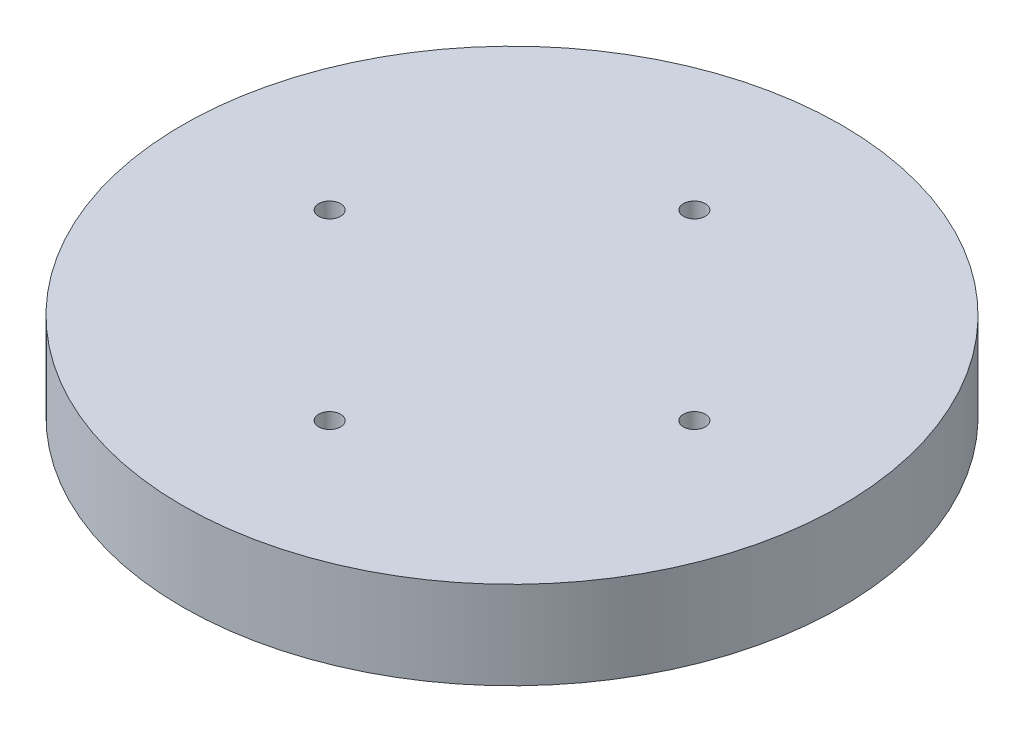
ISO-10303-21;
HEADER;
FILE_DESCRIPTION(('STEP AP214'),'2;1');
FILE_NAME('part.step','',(''),(''),'','','');
FILE_SCHEMA(('AUTOMOTIVE_DESIGN { 1 0 10303 214 1 1 1 1 }'));
ENDSEC;
DATA;
#1=APPLICATION_CONTEXT('core data for automotive mechanical design processes');
#2=APPLICATION_PROTOCOL_DEFINITION('international standard','automotive_design',2000,#1);
#3=PRODUCT_CONTEXT('',#1,'mechanical');
#4=PRODUCT('Part','Part','',(#3));
#5=PRODUCT_RELATED_PRODUCT_CATEGORY('part','',(#4));
#6=PRODUCT_DEFINITION_FORMATION('','',#4);
#7=PRODUCT_DEFINITION_CONTEXT('part definition',#1,'design');
#8=PRODUCT_DEFINITION('design','',#6,#7);
#9=PRODUCT_DEFINITION_SHAPE('','',#8);
#10=(LENGTH_UNIT() NAMED_UNIT(*) SI_UNIT(.MILLI.,.METRE.));
#11=(NAMED_UNIT(*) PLANE_ANGLE_UNIT() SI_UNIT($,.RADIAN.));
#12=(NAMED_UNIT(*) SI_UNIT($,.STERADIAN.) SOLID_ANGLE_UNIT());
#13=UNCERTAINTY_MEASURE_WITH_UNIT(LENGTH_MEASURE(1.E-05),#10,'distance_accuracy_value','');
#14=(GEOMETRIC_REPRESENTATION_CONTEXT(3) GLOBAL_UNCERTAINTY_ASSIGNED_CONTEXT((#13)) GLOBAL_UNIT_ASSIGNED_CONTEXT((#10,
#11,#12)) REPRESENTATION_CONTEXT('',''));
#15=CARTESIAN_POINT('',(0.,0.,0.));
#16=DIRECTION('',(0.,0.,1.));
#17=DIRECTION('',(1.,0.,0.));
#18=AXIS2_PLACEMENT_3D('',#15,#16,#17);
#19=CARTESIAN_POINT('',(0.,20.,0.));
#20=DIRECTION('',(0.,-1.,0.));
#21=DIRECTION('',(0.,0.,-1.));
#22=AXIS2_PLACEMENT_3D('',#19,#20,#21);
#23=CYLINDRICAL_SURFACE('',#22,75.);
#24=CARTESIAN_POINT('',(0.,20.,0.));
#25=DIRECTION('',(0.,1.,0.));
#26=DIRECTION('',(0.,0.,1.));
#27=AXIS2_PLACEMENT_3D('',#24,#25,#26);
#28=CIRCLE('',#27,75.);
#29=CARTESIAN_POINT('',(0.,20.,75.));
#30=VERTEX_POINT('',#29);
#31=EDGE_CURVE('E10',#30,#30,#28,.T.);
#32=ORIENTED_EDGE('',*,*,#31,.F.);
#33=EDGE_LOOP('',(#32));
#34=FACE_BOUND('',#33,.T.);
#35=CARTESIAN_POINT('',(0.,0.,0.));
#36=DIRECTION('',(0.,1.,0.));
#37=DIRECTION('',(0.,0.,1.));
#38=AXIS2_PLACEMENT_3D('',#35,#36,#37);
#39=CIRCLE('',#38,75.);
#40=CARTESIAN_POINT('',(0.,0.,75.));
#41=VERTEX_POINT('',#40);
#42=EDGE_CURVE('E34',#41,#41,#39,.T.);
#43=ORIENTED_EDGE('',*,*,#42,.T.);
#44=EDGE_LOOP('',(#43));
#45=FACE_BOUND('',#44,.T.);
#46=ADVANCED_FACE('F31',(#34,#45),#23,.T.);
#47=CARTESIAN_POINT('',(0.,20.,0.));
#48=DIRECTION('',(0.,1.,0.));
#49=DIRECTION('',(0.,0.,1.));
#50=AXIS2_PLACEMENT_3D('',#47,#48,#49);
#51=PLANE('',#50);
#52=CARTESIAN_POINT('',(0.,20.,-41.5));
#53=DIRECTION('',(0.,1.,0.));
#54=DIRECTION('',(0.,0.,1.));
#55=AXIS2_PLACEMENT_3D('',#52,#53,#54);
#56=CIRCLE('',#55,2.5);
#57=CARTESIAN_POINT('',(0.,20.,-39.));
#58=VERTEX_POINT('',#57);
#59=EDGE_CURVE('E59',#58,#58,#56,.T.);
#60=ORIENTED_EDGE('',*,*,#59,.F.);
#61=EDGE_LOOP('',(#60));
#62=FACE_BOUND('',#61,.T.);
#63=CARTESIAN_POINT('',(41.5000000000012,20.,-1.18575530284489E-12));
#64=DIRECTION('',(0.,1.,0.));
#65=DIRECTION('',(0.,0.,1.));
#66=AXIS2_PLACEMENT_3D('',#63,#64,#65);
#67=CIRCLE('',#66,2.50000000000094);
#68=CARTESIAN_POINT('',(41.5000000000012,20.,2.49999999999976));
#69=VERTEX_POINT('',#68);
#70=EDGE_CURVE('E53',#69,#69,#67,.T.);
#71=ORIENTED_EDGE('',*,*,#70,.F.);
#72=EDGE_LOOP('',(#71));
#73=FACE_BOUND('',#72,.T.);
#74=CARTESIAN_POINT('',(2.37151060568978E-12,20.,41.5));
#75=DIRECTION('',(0.,1.,0.));
#76=DIRECTION('',(0.,0.,1.));
#77=AXIS2_PLACEMENT_3D('',#74,#75,#76);
#78=CIRCLE('',#77,2.50000000000256);
#79=CARTESIAN_POINT('',(2.37151060568978E-12,20.,44.0000000000026));
#80=VERTEX_POINT('',#79);
#81=EDGE_CURVE('E46',#80,#80,#78,.T.);
#82=ORIENTED_EDGE('',*,*,#81,.F.);
#83=EDGE_LOOP('',(#82));
#84=FACE_BOUND('',#83,.T.);
#85=CARTESIAN_POINT('',(-41.4999999999988,20.,1.19083758706135E-12));
#86=DIRECTION('',(0.,1.,0.));
#87=DIRECTION('',(0.,0.,1.));
#88=AXIS2_PLACEMENT_3D('',#85,#86,#87);
#89=CIRCLE('',#88,2.50000000000192);
#90=CARTESIAN_POINT('',(-41.4999999999988,20.,2.50000000000311));
#91=VERTEX_POINT('',#90);
#92=EDGE_CURVE('E47',#91,#91,#89,.T.);
#93=ORIENTED_EDGE('',*,*,#92,.F.);
#94=EDGE_LOOP('',(#93));
#95=FACE_BOUND('',#94,.T.);
#96=ORIENTED_EDGE('',*,*,#31,.T.);
#97=EDGE_LOOP('',(#96));
#98=FACE_BOUND('',#97,.T.);
#99=ADVANCED_FACE('F70',(#62,#73,#84,#95,#98),#51,.T.);
#100=CARTESIAN_POINT('',(0.,0.,0.));
#101=DIRECTION('',(0.,1.,0.));
#102=DIRECTION('',(0.,0.,1.));
#103=AXIS2_PLACEMENT_3D('',#100,#101,#102);
#104=PLANE('',#103);
#105=CARTESIAN_POINT('',(0.,0.,-41.5));
#106=DIRECTION('',(0.,1.,0.));
#107=DIRECTION('',(0.,0.,1.));
#108=AXIS2_PLACEMENT_3D('',#105,#106,#107);
#109=CIRCLE('',#108,2.5);
#110=CARTESIAN_POINT('',(0.,0.,-39.));
#111=VERTEX_POINT('',#110);
#112=EDGE_CURVE('E41',#111,#111,#109,.F.);
#113=ORIENTED_EDGE('',*,*,#112,.F.);
#114=EDGE_LOOP('',(#113));
#115=FACE_BOUND('',#114,.T.);
#116=CARTESIAN_POINT('',(41.5000000000012,0.,-1.18575530284489E-12));
#117=DIRECTION('',(0.,1.,0.));
#118=DIRECTION('',(0.,0.,1.));
#119=AXIS2_PLACEMENT_3D('',#116,#117,#118);
#120=CIRCLE('',#119,2.50000000000094);
#121=CARTESIAN_POINT('',(41.5000000000012,0.,2.49999999999976));
#122=VERTEX_POINT('',#121);
#123=EDGE_CURVE('E56',#122,#122,#120,.F.);
#124=ORIENTED_EDGE('',*,*,#123,.F.);
#125=EDGE_LOOP('',(#124));
#126=FACE_BOUND('',#125,.T.);
#127=CARTESIAN_POINT('',(2.37151060568978E-12,0.,41.5));
#128=DIRECTION('',(0.,1.,0.));
#129=DIRECTION('',(0.,0.,1.));
#130=AXIS2_PLACEMENT_3D('',#127,#128,#129);
#131=CIRCLE('',#130,2.50000000000256);
#132=CARTESIAN_POINT('',(2.37151060568978E-12,0.,44.0000000000026));
#133=VERTEX_POINT('',#132);
#134=EDGE_CURVE('E50',#133,#133,#131,.F.);
#135=ORIENTED_EDGE('',*,*,#134,.F.);
#136=EDGE_LOOP('',(#135));
#137=FACE_BOUND('',#136,.T.);
#138=CARTESIAN_POINT('',(-41.4999999999988,0.,1.19083758706135E-12));
#139=DIRECTION('',(0.,1.,0.));
#140=DIRECTION('',(0.,0.,1.));
#141=AXIS2_PLACEMENT_3D('',#138,#139,#140);
#142=CIRCLE('',#141,2.50000000000192);
#143=CARTESIAN_POINT('',(-41.4999999999988,0.,2.50000000000311));
#144=VERTEX_POINT('',#143);
#145=EDGE_CURVE('E43',#144,#144,#142,.F.);
#146=ORIENTED_EDGE('',*,*,#145,.F.);
#147=EDGE_LOOP('',(#146));
#148=FACE_BOUND('',#147,.T.);
#149=ORIENTED_EDGE('',*,*,#42,.F.);
#150=EDGE_LOOP('',(#149));
#151=FACE_BOUND('',#150,.T.);
#152=ADVANCED_FACE('F73',(#115,#126,#137,#148,#151),#104,.F.);
#153=CARTESIAN_POINT('',(-41.4999999999988,-0.001000000000001,1.19083758706135E-12));
#154=DIRECTION('',(0.,1.,0.));
#155=DIRECTION('',(0.,0.,1.));
#156=AXIS2_PLACEMENT_3D('',#153,#154,#155);
#157=CYLINDRICAL_SURFACE('',#156,2.50000000000192);
#158=ORIENTED_EDGE('',*,*,#92,.T.);
#159=EDGE_LOOP('',(#158));
#160=FACE_BOUND('',#159,.T.);
#161=ORIENTED_EDGE('',*,*,#145,.T.);
#162=EDGE_LOOP('',(#161));
#163=FACE_BOUND('',#162,.T.);
#164=ADVANCED_FACE('F81',(#160,#163),#157,.F.);
#165=CARTESIAN_POINT('',(2.37151060568978E-12,-0.001000000000001,41.5));
#166=DIRECTION('',(0.,1.,0.));
#167=DIRECTION('',(0.,0.,1.));
#168=AXIS2_PLACEMENT_3D('',#165,#166,#167);
#169=CYLINDRICAL_SURFACE('',#168,2.50000000000256);
#170=ORIENTED_EDGE('',*,*,#81,.T.);
#171=EDGE_LOOP('',(#170));
#172=FACE_BOUND('',#171,.T.);
#173=ORIENTED_EDGE('',*,*,#134,.T.);
#174=EDGE_LOOP('',(#173));
#175=FACE_BOUND('',#174,.T.);
#176=ADVANCED_FACE('F84',(#172,#175),#169,.F.);
#177=CARTESIAN_POINT('',(41.5000000000012,-0.001000000000001,-1.18575530284489E-12));
#178=DIRECTION('',(0.,1.,0.));
#179=DIRECTION('',(0.,0.,1.));
#180=AXIS2_PLACEMENT_3D('',#177,#178,#179);
#181=CYLINDRICAL_SURFACE('',#180,2.50000000000094);
#182=ORIENTED_EDGE('',*,*,#70,.T.);
#183=EDGE_LOOP('',(#182));
#184=FACE_BOUND('',#183,.T.);
#185=ORIENTED_EDGE('',*,*,#123,.T.);
#186=EDGE_LOOP('',(#185));
#187=FACE_BOUND('',#186,.T.);
#188=ADVANCED_FACE('F115',(#184,#187),#181,.F.);
#189=CARTESIAN_POINT('',(0.,-0.001000000000001,-41.5));
#190=DIRECTION('',(0.,1.,0.));
#191=DIRECTION('',(0.,0.,1.));
#192=AXIS2_PLACEMENT_3D('',#189,#190,#191);
#193=CYLINDRICAL_SURFACE('',#192,2.5);
#194=ORIENTED_EDGE('',*,*,#59,.T.);
#195=EDGE_LOOP('',(#194));
#196=FACE_BOUND('',#195,.T.);
#197=ORIENTED_EDGE('',*,*,#112,.T.);
#198=EDGE_LOOP('',(#197));
#199=FACE_BOUND('',#198,.T.);
#200=ADVANCED_FACE('F67',(#196,#199),#193,.F.);
#201=CLOSED_SHELL('',(#46,#99,#152,#164,#176,#188,#200));
#202=MANIFOLD_SOLID_BREP('B2',#201);
#203=ADVANCED_BREP_SHAPE_REPRESENTATION('',(#18,#202),#14);
#204=SHAPE_DEFINITION_REPRESENTATION(#9,#203);
ENDSEC;
END-ISO-10303-21;
